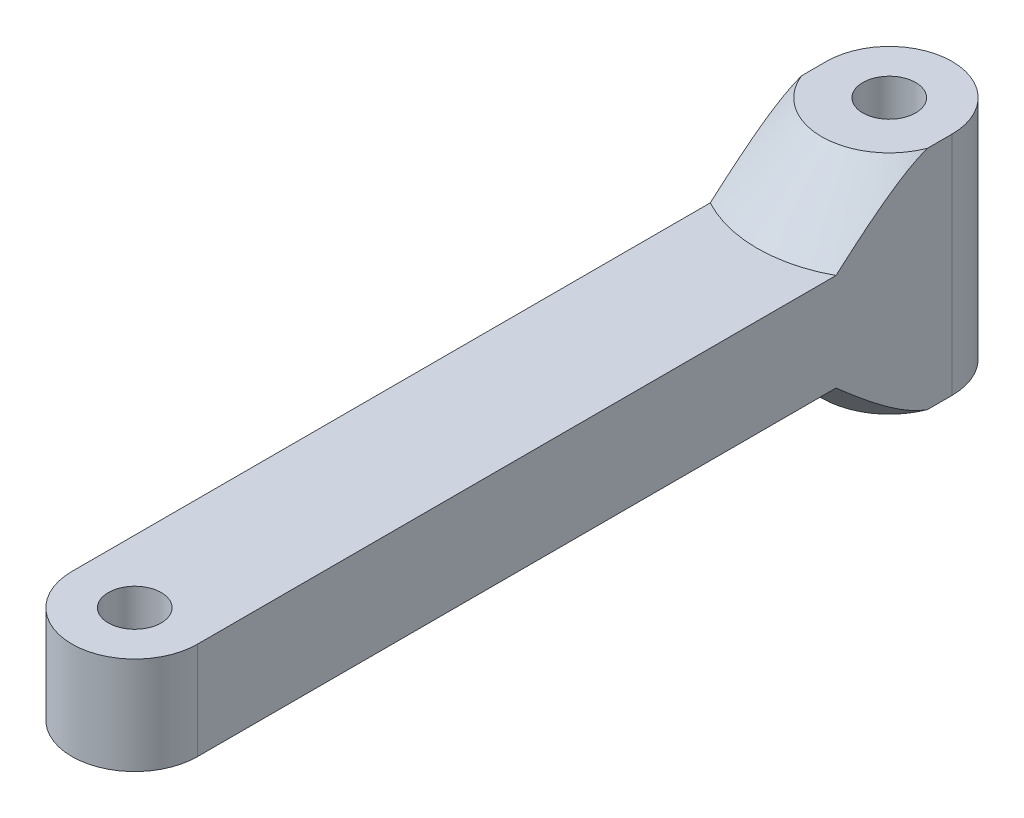
ISO-10303-21;
HEADER;
FILE_DESCRIPTION(('STEP AP214'),'2;1');
FILE_NAME('part.step','',(''),(''),'','','');
FILE_SCHEMA(('AUTOMOTIVE_DESIGN { 1 0 10303 214 1 1 1 1 }'));
ENDSEC;
DATA;
#1=APPLICATION_CONTEXT('core data for automotive mechanical design processes');
#2=APPLICATION_PROTOCOL_DEFINITION('international standard','automotive_design',2000,#1);
#3=PRODUCT_CONTEXT('',#1,'mechanical');
#4=PRODUCT('Part','Part','',(#3));
#5=PRODUCT_RELATED_PRODUCT_CATEGORY('part','',(#4));
#6=PRODUCT_DEFINITION_FORMATION('','',#4);
#7=PRODUCT_DEFINITION_CONTEXT('part definition',#1,'design');
#8=PRODUCT_DEFINITION('design','',#6,#7);
#9=PRODUCT_DEFINITION_SHAPE('','',#8);
#10=(LENGTH_UNIT() NAMED_UNIT(*) SI_UNIT(.MILLI.,.METRE.));
#11=(NAMED_UNIT(*) PLANE_ANGLE_UNIT() SI_UNIT($,.RADIAN.));
#12=(NAMED_UNIT(*) SI_UNIT($,.STERADIAN.) SOLID_ANGLE_UNIT());
#13=UNCERTAINTY_MEASURE_WITH_UNIT(LENGTH_MEASURE(1.E-05),#10,'distance_accuracy_value','');
#14=(GEOMETRIC_REPRESENTATION_CONTEXT(3) GLOBAL_UNCERTAINTY_ASSIGNED_CONTEXT((#13)) GLOBAL_UNIT_ASSIGNED_CONTEXT((#10,
#11,#12)) REPRESENTATION_CONTEXT('',''));
#15=CARTESIAN_POINT('',(0.,0.,0.));
#16=DIRECTION('',(0.,0.,1.));
#17=DIRECTION('',(1.,0.,0.));
#18=AXIS2_PLACEMENT_3D('',#15,#16,#17);
#19=CARTESIAN_POINT('',(0.,3.875,0.));
#20=DIRECTION('',(0.,1.,0.));
#21=DIRECTION('',(0.,0.,1.));
#22=AXIS2_PLACEMENT_3D('',#19,#20,#21);
#23=PLANE('',#22);
#24=CARTESIAN_POINT('',(0.,3.875,0.));
#25=DIRECTION('',(0.,1.,0.));
#26=DIRECTION('',(0.,0.,1.));
#27=AXIS2_PLACEMENT_3D('',#24,#25,#26);
#28=CIRCLE('',#27,2.1);
#29=CARTESIAN_POINT('',(0.,3.875,2.1));
#30=VERTEX_POINT('',#29);
#31=EDGE_CURVE('E253',#30,#30,#28,.T.);
#32=ORIENTED_EDGE('',*,*,#31,.F.);
#33=EDGE_LOOP('',(#32));
#34=FACE_BOUND('',#33,.T.);
#35=DIRECTION('',(0.,0.,-1.));
#36=VECTOR('',#35,1.);
#37=CARTESIAN_POINT('',(5.,3.875,0.));
#38=LINE('',#37,#36);
#39=CARTESIAN_POINT('',(5.,3.875,0.));
#40=VERTEX_POINT('',#39);
#41=CARTESIAN_POINT('',(5.,3.875,-50.7669073436902));
#42=VERTEX_POINT('',#41);
#43=EDGE_CURVE('E112',#40,#42,#38,.T.);
#44=ORIENTED_EDGE('',*,*,#43,.T.);
#45=CARTESIAN_POINT('',(0.,3.875,-60.));
#46=DIRECTION('',(0.,1.,0.));
#47=DIRECTION('',(0.,0.,1.));
#48=AXIS2_PLACEMENT_3D('',#45,#46,#47);
#49=CIRCLE('',#48,10.5000000000001);
#50=CARTESIAN_POINT('',(-5.,3.875,-50.7669073436902));
#51=VERTEX_POINT('',#50);
#52=EDGE_CURVE('E146',#42,#51,#49,.F.);
#53=ORIENTED_EDGE('',*,*,#52,.T.);
#54=DIRECTION('',(0.,0.,1.));
#55=VECTOR('',#54,1.);
#56=CARTESIAN_POINT('',(-5.,3.875,0.));
#57=LINE('',#56,#55);
#58=CARTESIAN_POINT('',(-5.,3.875,0.));
#59=VERTEX_POINT('',#58);
#60=EDGE_CURVE('E125',#51,#59,#57,.T.);
#61=ORIENTED_EDGE('',*,*,#60,.T.);
#62=CARTESIAN_POINT('',(0.,3.875,0.));
#63=DIRECTION('',(0.,1.,0.));
#64=DIRECTION('',(0.,0.,1.));
#65=AXIS2_PLACEMENT_3D('',#62,#63,#64);
#66=CIRCLE('',#65,5.);
#67=EDGE_CURVE('E126',#59,#40,#66,.T.);
#68=ORIENTED_EDGE('',*,*,#67,.T.);
#69=EDGE_LOOP('',(#44,#53,#61,#68));
#70=FACE_BOUND('',#69,.T.);
#71=ADVANCED_FACE('F41',(#34,#70),#23,.T.);
#72=CARTESIAN_POINT('',(0.,-3.875,0.));
#73=DIRECTION('',(0.,1.,0.));
#74=DIRECTION('',(0.,0.,1.));
#75=AXIS2_PLACEMENT_3D('',#72,#73,#74);
#76=PLANE('',#75);
#77=CARTESIAN_POINT('',(0.,-3.875,0.));
#78=DIRECTION('',(0.,1.,0.));
#79=DIRECTION('',(0.,0.,1.));
#80=AXIS2_PLACEMENT_3D('',#77,#78,#79);
#81=CIRCLE('',#80,2.1);
#82=CARTESIAN_POINT('',(0.,-3.875,2.1));
#83=VERTEX_POINT('',#82);
#84=EDGE_CURVE('E246',#83,#83,#81,.T.);
#85=ORIENTED_EDGE('',*,*,#84,.T.);
#86=EDGE_LOOP('',(#85));
#87=FACE_BOUND('',#86,.T.);
#88=DIRECTION('',(0.,0.,1.));
#89=VECTOR('',#88,1.);
#90=CARTESIAN_POINT('',(-5.,-3.875,0.));
#91=LINE('',#90,#89);
#92=CARTESIAN_POINT('',(-5.,-3.875,-50.7669073436903));
#93=VERTEX_POINT('',#92);
#94=CARTESIAN_POINT('',(-5.,-3.875,0.));
#95=VERTEX_POINT('',#94);
#96=EDGE_CURVE('E134',#93,#95,#91,.T.);
#97=ORIENTED_EDGE('',*,*,#96,.F.);
#98=CARTESIAN_POINT('',(0.,-3.875,-60.));
#99=DIRECTION('',(0.,1.,0.));
#100=DIRECTION('',(0.,0.,1.));
#101=AXIS2_PLACEMENT_3D('',#98,#99,#100);
#102=CIRCLE('',#101,10.5);
#103=CARTESIAN_POINT('',(5.,-3.875,-50.7669073436903));
#104=VERTEX_POINT('',#103);
#105=EDGE_CURVE('E140',#93,#104,#102,.T.);
#106=ORIENTED_EDGE('',*,*,#105,.T.);
#107=DIRECTION('',(0.,0.,-1.));
#108=VECTOR('',#107,1.);
#109=CARTESIAN_POINT('',(5.,-3.875,0.));
#110=LINE('',#109,#108);
#111=CARTESIAN_POINT('',(5.,-3.875,0.));
#112=VERTEX_POINT('',#111);
#113=EDGE_CURVE('E222',#112,#104,#110,.T.);
#114=ORIENTED_EDGE('',*,*,#113,.F.);
#115=CARTESIAN_POINT('',(0.,-3.875,0.));
#116=DIRECTION('',(0.,1.,0.));
#117=DIRECTION('',(0.,0.,1.));
#118=AXIS2_PLACEMENT_3D('',#115,#116,#117);
#119=CIRCLE('',#118,5.);
#120=EDGE_CURVE('E138',#95,#112,#119,.T.);
#121=ORIENTED_EDGE('',*,*,#120,.F.);
#122=EDGE_LOOP('',(#97,#106,#114,#121));
#123=FACE_BOUND('',#122,.T.);
#124=ADVANCED_FACE('F186',(#87,#123),#76,.F.);
#125=CARTESIAN_POINT('',(0.,3.875,0.));
#126=DIRECTION('',(0.,-1.,0.));
#127=DIRECTION('',(0.,0.,-1.));
#128=AXIS2_PLACEMENT_3D('',#125,#126,#127);
#129=CYLINDRICAL_SURFACE('',#128,5.);
#130=ORIENTED_EDGE('',*,*,#120,.T.);
#131=DIRECTION('',(0.,-1.,0.));
#132=VECTOR('',#131,1.);
#133=CARTESIAN_POINT('',(5.,3.875,0.));
#134=LINE('',#133,#132);
#135=EDGE_CURVE('E117',#40,#112,#134,.T.);
#136=ORIENTED_EDGE('',*,*,#135,.F.);
#137=ORIENTED_EDGE('',*,*,#67,.F.);
#138=DIRECTION('',(0.,-1.,0.));
#139=VECTOR('',#138,1.);
#140=CARTESIAN_POINT('',(-5.,3.875,0.));
#141=LINE('',#140,#139);
#142=EDGE_CURVE('E237',#59,#95,#141,.T.);
#143=ORIENTED_EDGE('',*,*,#142,.T.);
#144=EDGE_LOOP('',(#130,#136,#137,#143));
#145=FACE_BOUND('',#144,.T.);
#146=ADVANCED_FACE('F136',(#145),#129,.T.);
#147=CARTESIAN_POINT('',(5.,3.875,0.));
#148=DIRECTION('',(-1.,0.,0.));
#149=DIRECTION('',(0.,0.,1.));
#150=AXIS2_PLACEMENT_3D('',#147,#148,#149);
#151=PLANE('',#150);
#152=ORIENTED_EDGE('',*,*,#113,.T.);
#153=CARTESIAN_POINT('',(5.,-3.875,-50.7669073436903));
#154=CARTESIAN_POINT('',(5.,-4.01971598849579,-50.9314919699273));
#155=CARTESIAN_POINT('',(5.,-4.1639493716717,-51.0965032375605));
#156=CARTESIAN_POINT('',(5.,-4.45126957204784,-51.4275301742866));
#157=CARTESIAN_POINT('',(5.,-4.59435635122837,-51.5935458763675));
#158=CARTESIAN_POINT('',(5.,-4.87931998211735,-51.9268711772716));
#159=CARTESIAN_POINT('',(5.,-5.02119563517117,-52.0941818019338));
#160=CARTESIAN_POINT('',(5.,-5.30336332123864,-52.4301315363657));
#161=CARTESIAN_POINT('',(5.,-5.44365537013182,-52.5987706327854));
#162=CARTESIAN_POINT('',(5.,-5.72442969691356,-52.9401182460885));
#163=CARTESIAN_POINT('',(5.,-5.86488378077753,-53.1128499858756));
#164=CARTESIAN_POINT('',(5.,-6.14345285463368,-53.4601886224498));
#165=CARTESIAN_POINT('',(5.,-6.28156787583037,-53.6347954941708));
#166=CARTESIAN_POINT('',(5.,-6.55490196814796,-53.986172151773));
#167=CARTESIAN_POINT('',(5.,-6.69012199906723,-54.1629411892894));
#168=CARTESIAN_POINT('',(5.,-6.9570360167112,-54.5191157112881));
#169=CARTESIAN_POINT('',(5.,-7.08873015181964,-54.6985210843292));
#170=CARTESIAN_POINT('',(5.,-7.3685986360361,-55.0896779959594));
#171=CARTESIAN_POINT('',(5.,-7.51600654118542,-55.3019809016229));
#172=CARTESIAN_POINT('',(5.,-7.80301609945039,-55.7319077428479));
#173=CARTESIAN_POINT('',(5.,-7.9426159665539,-55.9495328795884));
#174=CARTESIAN_POINT('',(5.,-8.21100542731597,-56.3909140013737));
#175=CARTESIAN_POINT('',(5.,-8.33981235069278,-56.6146593621457));
#176=CARTESIAN_POINT('',(5.,-8.58290652164166,-57.0699167479803));
#177=CARTESIAN_POINT('',(5.,-8.69720081654621,-57.3014249338402));
#178=CARTESIAN_POINT('',(5.,-8.87116747342159,-57.6951895936233));
#179=CARTESIAN_POINT('',(5.,-8.93639183350701,-57.8549815165499));
#180=CARTESIAN_POINT('',(5.,-9.05575467351057,-58.1787341043541));
#181=CARTESIAN_POINT('',(5.,-9.10989180781256,-58.3426952725265));
#182=CARTESIAN_POINT('',(5.,-9.20450911023407,-58.6737281940993));
#183=CARTESIAN_POINT('',(5.,-9.24505212467734,-58.8407817573127));
#184=CARTESIAN_POINT('',(5.,-9.31054804738382,-59.1778581062459));
#185=CARTESIAN_POINT('',(5.,-9.33551447012895,-59.3478781861268));
#186=CARTESIAN_POINT('',(5.,-9.35954640925023,-59.5985918422289));
#187=CARTESIAN_POINT('',(5.,-9.36532505617897,-59.6786798119947));
#188=CARTESIAN_POINT('',(5.,-9.37305842534963,-59.8391735637367));
#189=CARTESIAN_POINT('',(5.,-9.37500675480122,-59.9195796529799));
#190=CARTESIAN_POINT('',(5.,-9.3750000000001,-60.));
#191=B_SPLINE_CURVE_WITH_KNOTS('',3,(#153,#154,#155,#156,#157,#158,#159,#160,#161,#162,#163,
#164,#165,#166,#167,#168,#169,#170,#171,#172,#173,#174,#175,#176,#177,#178,#179,#180,#181,#182,
#183,#184,#185,#186,#187,#188,#189,#190),.UNSPECIFIED.,.F.,.F.,(4,2,2,2,2,2,2,2,2,2,2,2,2,2,2,2,
2,2,4),(0.,0.657479640295268,1.31498099217978,1.97307132503851,2.63115505304804,
3.29902478138143,3.96688559290235,4.63452144284482,5.30212915170297,6.07737897532751,
6.85280541056131,7.62696191877513,8.40074104708055,8.9181912776782,9.43570427215405,
9.9507906833294,10.4654295741529,10.7062381890889,10.9474483729452),.UNSPECIFIED.);
#192=CARTESIAN_POINT('',(5.,-9.,-58.0275332702423));
#193=VERTEX_POINT('',#192);
#194=EDGE_CURVE('E164',#104,#193,#191,.T.);
#195=ORIENTED_EDGE('',*,*,#194,.T.);
#196=DIRECTION('',(0.,0.,1.));
#197=VECTOR('',#196,1.);
#198=CARTESIAN_POINT('',(5.,-9.,-60.));
#199=LINE('',#198,#197);
#200=CARTESIAN_POINT('',(5.,-9.,-60.));
#201=VERTEX_POINT('',#200);
#202=EDGE_CURVE('E199',#201,#193,#199,.T.);
#203=ORIENTED_EDGE('',*,*,#202,.F.);
#204=DIRECTION('',(0.,-1.,0.));
#205=VECTOR('',#204,1.);
#206=CARTESIAN_POINT('',(5.,3.875,-60.));
#207=LINE('',#206,#205);
#208=CARTESIAN_POINT('',(5.,9.,-60.));
#209=VERTEX_POINT('',#208);
#210=EDGE_CURVE('E141',#209,#201,#207,.T.);
#211=ORIENTED_EDGE('',*,*,#210,.F.);
#212=DIRECTION('',(0.,0.,-1.));
#213=VECTOR('',#212,1.);
#214=CARTESIAN_POINT('',(5.,9.,0.));
#215=LINE('',#214,#213);
#216=CARTESIAN_POINT('',(5.,9.,-58.0275332702424));
#217=VERTEX_POINT('',#216);
#218=EDGE_CURVE('E11',#209,#217,#215,.F.);
#219=ORIENTED_EDGE('',*,*,#218,.T.);
#220=CARTESIAN_POINT('',(5.,9.37500000000004,-60.));
#221=CARTESIAN_POINT('',(5.,9.37500620782414,-59.9230445299401));
#222=CARTESIAN_POINT('',(5.,9.37322245757581,-59.8461003728485));
#223=CARTESIAN_POINT('',(5.,9.36613350151536,-59.6923867696457));
#224=CARTESIAN_POINT('',(5.,9.36082887638487,-59.6156172968194));
#225=CARTESIAN_POINT('',(5.,9.33975216479667,-59.38610617518));
#226=CARTESIAN_POINT('',(5.,9.3188167108698,-59.2338138032467));
#227=CARTESIAN_POINT('',(5.,9.26480035865172,-58.9344252496194));
#228=CARTESIAN_POINT('',(5.,9.2319564096161,-58.7872852569143));
#229=CARTESIAN_POINT('',(5.,9.15553002968612,-58.4957886644185));
#230=CARTESIAN_POINT('',(5.,9.11194239957836,-58.3514334488496));
#231=CARTESIAN_POINT('',(5.,8.95845410281823,-57.8962887567637));
#232=CARTESIAN_POINT('',(5.,8.83124526960499,-57.5912948855139));
#233=CARTESIAN_POINT('',(5.,8.61855155214308,-57.1445076039472));
#234=CARTESIAN_POINT('',(5.,8.54391488600827,-56.9972099141717));
#235=CARTESIAN_POINT('',(5.,8.3886370036102,-56.7058003414683));
#236=CARTESIAN_POINT('',(5.,8.30799649143467,-56.5616880875382));
#237=CARTESIAN_POINT('',(5.,8.13998751590453,-56.2731458917103));
#238=CARTESIAN_POINT('',(5.,8.05250907637106,-56.1287806180112));
#239=CARTESIAN_POINT('',(5.,7.87337826286647,-55.8426537855585));
#240=CARTESIAN_POINT('',(5.,7.78172556235495,-55.7008924317235));
#241=CARTESIAN_POINT('',(5.,7.59507629215959,-55.4197816554874));
#242=CARTESIAN_POINT('',(5.,7.50008283022762,-55.280430162413));
#243=CARTESIAN_POINT('',(5.,7.30725006150687,-55.0037082652957));
#244=CARTESIAN_POINT('',(5.,7.2094106579108,-54.8663379288819));
#245=CARTESIAN_POINT('',(5.,6.98225331583684,-54.5532123196063));
#246=CARTESIAN_POINT('',(5.,6.8521336476002,-54.3780392923126));
#247=CARTESIAN_POINT('',(5.,6.58869285163815,-54.0301190387981));
#248=CARTESIAN_POINT('',(5.,6.45537165265003,-53.8573718667102));
#249=CARTESIAN_POINT('',(5.,6.18606950085157,-53.5138646106626));
#250=CARTESIAN_POINT('',(5.,6.05008759141134,-53.3431052779585));
#251=CARTESIAN_POINT('',(5.,5.77596697794933,-53.0033263628371));
#252=CARTESIAN_POINT('',(5.,5.63782825082806,-52.8343067990848));
#253=CARTESIAN_POINT('',(5.,5.36610223845678,-52.5054407418882));
#254=CARTESIAN_POINT('',(5.,5.2325952130683,-52.3455278478676));
#255=CARTESIAN_POINT('',(5.,4.96418883562373,-52.026874059781));
#256=CARTESIAN_POINT('',(5.,4.8292894748411,-51.8681331730712));
#257=CARTESIAN_POINT('',(5.,4.55841049332242,-51.5517985969286));
#258=CARTESIAN_POINT('',(5.,4.42243183156918,-51.3942040855268));
#259=CARTESIAN_POINT('',(5.,4.14944759692059,-51.0799136313472));
#260=CARTESIAN_POINT('',(5.,4.01244204984865,-50.9232176661471));
#261=CARTESIAN_POINT('',(5.,3.875,-50.7669073436902));
#262=B_SPLINE_CURVE_WITH_KNOTS('',3,(#220,#221,#222,#223,#224,#225,#226,#227,#228,#229,#230,
#231,#232,#233,#234,#235,#236,#237,#238,#239,#240,#241,#242,#243,#244,#245,#246,#247,#248,#249,
#250,#251,#252,#253,#254,#255,#256,#257,#258,#259,#260,#261),.UNSPECIFIED.,.F.,.F.,(4,2,2,2,2,2,
2,2,2,2,2,2,2,2,2,2,2,2,2,2,4),(0.,0.230824134272519,0.461610209243227,0.922142248521532,
1.37397300884593,1.82602285541044,2.81455595863844,3.30988827456912,3.80516259272366,
4.31148858298634,4.81785424993194,5.32376072046427,5.82968442003379,6.48427415375995,
7.13887847149401,7.7937226347989,8.4485738162963,9.07351782145017,9.69846574585423,
10.3229096454597,10.9473378943189),.UNSPECIFIED.);
#263=EDGE_CURVE('E120',#217,#42,#262,.T.);
#264=ORIENTED_EDGE('',*,*,#263,.T.);
#265=ORIENTED_EDGE('',*,*,#43,.F.);
#266=ORIENTED_EDGE('',*,*,#135,.T.);
#267=EDGE_LOOP('',(#152,#195,#203,#211,#219,#264,#265,#266));
#268=FACE_BOUND('',#267,.T.);
#269=ADVANCED_FACE('F115',(#268),#151,.F.);
#270=CARTESIAN_POINT('',(0.,3.875,-60.));
#271=DIRECTION('',(0.,-1.,0.));
#272=DIRECTION('',(0.,0.,-1.));
#273=AXIS2_PLACEMENT_3D('',#270,#271,#272);
#274=CYLINDRICAL_SURFACE('',#273,5.);
#275=CARTESIAN_POINT('',(0.,-9.,-60.));
#276=DIRECTION('',(0.,1.,0.));
#277=DIRECTION('',(0.,0.,1.));
#278=AXIS2_PLACEMENT_3D('',#275,#276,#277);
#279=CIRCLE('',#278,5.);
#280=CARTESIAN_POINT('',(-5.,-9.,-60.));
#281=VERTEX_POINT('',#280);
#282=EDGE_CURVE('E227',#201,#281,#279,.T.);
#283=ORIENTED_EDGE('',*,*,#282,.T.);
#284=DIRECTION('',(0.,-1.,0.));
#285=VECTOR('',#284,1.);
#286=CARTESIAN_POINT('',(-5.,3.875,-60.));
#287=LINE('',#286,#285);
#288=CARTESIAN_POINT('',(-5.,9.,-60.));
#289=VERTEX_POINT('',#288);
#290=EDGE_CURVE('E148',#289,#281,#287,.T.);
#291=ORIENTED_EDGE('',*,*,#290,.F.);
#292=CARTESIAN_POINT('',(0.,9.,-60.));
#293=DIRECTION('',(0.,1.,0.));
#294=DIRECTION('',(0.,0.,1.));
#295=AXIS2_PLACEMENT_3D('',#292,#293,#294);
#296=CIRCLE('',#295,5.);
#297=EDGE_CURVE('E209',#209,#289,#296,.T.);
#298=ORIENTED_EDGE('',*,*,#297,.F.);
#299=ORIENTED_EDGE('',*,*,#210,.T.);
#300=EDGE_LOOP('',(#283,#291,#298,#299));
#301=FACE_BOUND('',#300,.T.);
#302=ADVANCED_FACE('F189',(#301),#274,.T.);
#303=CARTESIAN_POINT('',(-5.,3.875,0.));
#304=DIRECTION('',(1.,0.,0.));
#305=DIRECTION('',(0.,0.,-1.));
#306=AXIS2_PLACEMENT_3D('',#303,#304,#305);
#307=PLANE('',#306);
#308=ORIENTED_EDGE('',*,*,#290,.T.);
#309=DIRECTION('',(0.,0.,-1.));
#310=VECTOR('',#309,1.);
#311=CARTESIAN_POINT('',(-5.,-9.,-60.));
#312=LINE('',#311,#310);
#313=CARTESIAN_POINT('',(-5.,-9.,-58.0275332702423));
#314=VERTEX_POINT('',#313);
#315=EDGE_CURVE('E52',#281,#314,#312,.F.);
#316=ORIENTED_EDGE('',*,*,#315,.T.);
#317=CARTESIAN_POINT('',(-5.,-9.3750000000001,-60.));
#318=CARTESIAN_POINT('',(-5.,-9.3750062078242,-59.9230445299401));
#319=CARTESIAN_POINT('',(-5.,-9.37322245757587,-59.8461003728485));
#320=CARTESIAN_POINT('',(-5.,-9.36613350151542,-59.6923867696457));
#321=CARTESIAN_POINT('',(-5.,-9.36082887638493,-59.6156172968194));
#322=CARTESIAN_POINT('',(-5.,-9.33975216479673,-59.38610617518));
#323=CARTESIAN_POINT('',(-5.,-9.31881671086986,-59.2338138032467));
#324=CARTESIAN_POINT('',(-5.,-9.26480035865177,-58.9344252496194));
#325=CARTESIAN_POINT('',(-5.,-9.23195640961615,-58.7872852569144));
#326=CARTESIAN_POINT('',(-5.,-9.15553002968618,-58.4957886644185));
#327=CARTESIAN_POINT('',(-5.,-9.11194239957842,-58.3514334488496));
#328=CARTESIAN_POINT('',(-5.,-8.95845410281829,-57.8962887567638));
#329=CARTESIAN_POINT('',(-5.,-8.83124526960505,-57.591294885514));
#330=CARTESIAN_POINT('',(-5.,-8.61855155214315,-57.1445076039473));
#331=CARTESIAN_POINT('',(-5.,-8.54391488600834,-56.9972099141718));
#332=CARTESIAN_POINT('',(-5.,-8.38863700361028,-56.7058003414684));
#333=CARTESIAN_POINT('',(-5.,-8.30799649143475,-56.5616880875383));
#334=CARTESIAN_POINT('',(-5.,-8.13998751590462,-56.2731458917103));
#335=CARTESIAN_POINT('',(-5.,-8.05250907637116,-56.1287806180113));
#336=CARTESIAN_POINT('',(-5.,-7.87337826286657,-55.8426537855586));
#337=CARTESIAN_POINT('',(-5.,-7.78172556235505,-55.7008924317237));
#338=CARTESIAN_POINT('',(-5.,-7.59507629215969,-55.4197816554876));
#339=CARTESIAN_POINT('',(-5.,-7.50008283022772,-55.2804301624132));
#340=CARTESIAN_POINT('',(-5.,-7.30725006150698,-55.0037082652958));
#341=CARTESIAN_POINT('',(-5.,-7.20941065791092,-54.866337928882));
#342=CARTESIAN_POINT('',(-5.,-6.98225331583695,-54.5532123196064));
#343=CARTESIAN_POINT('',(-5.,-6.85213364760031,-54.3780392923127));
#344=CARTESIAN_POINT('',(-5.,-6.58869285163825,-54.0301190387982));
#345=CARTESIAN_POINT('',(-5.,-6.45537165265013,-53.8573718667103));
#346=CARTESIAN_POINT('',(-5.,-6.18606950085166,-53.5138646106627));
#347=CARTESIAN_POINT('',(-5.,-6.05008759141142,-53.3431052779586));
#348=CARTESIAN_POINT('',(-5.,-5.7759669779494,-53.0033263628372));
#349=CARTESIAN_POINT('',(-5.,-5.63782825082812,-52.834306799085));
#350=CARTESIAN_POINT('',(-5.,-5.36610223845684,-52.5054407418883));
#351=CARTESIAN_POINT('',(-5.,-5.23259521306835,-52.3455278478677));
#352=CARTESIAN_POINT('',(-5.,-4.96418883562377,-52.0268740597811));
#353=CARTESIAN_POINT('',(-5.,-4.82928947484114,-51.8681331730713));
#354=CARTESIAN_POINT('',(-5.,-4.55841049332244,-51.5517985969287));
#355=CARTESIAN_POINT('',(-5.,-4.4224318315692,-51.3942040855269));
#356=CARTESIAN_POINT('',(-5.,-4.1494475969206,-51.0799136313473));
#357=CARTESIAN_POINT('',(-5.,-4.01244204984865,-50.9232176661472));
#358=CARTESIAN_POINT('',(-5.,-3.875,-50.7669073436903));
#359=B_SPLINE_CURVE_WITH_KNOTS('',3,(#317,#318,#319,#320,#321,#322,#323,#324,#325,#326,#327,
#328,#329,#330,#331,#332,#333,#334,#335,#336,#337,#338,#339,#340,#341,#342,#343,#344,#345,#346,
#347,#348,#349,#350,#351,#352,#353,#354,#355,#356,#357,#358),.UNSPECIFIED.,.F.,.F.,(4,2,2,2,2,2,
2,2,2,2,2,2,2,2,2,2,2,2,2,2,4),(0.,0.230824134272519,0.461610209243227,0.922142248521524,
1.37397300884591,1.82602285541041,2.81455595863838,3.30988827456905,3.80516259272356,
4.31148858298623,4.81785424993182,5.32376072046414,5.82968442003363,6.4842741537598,
7.13887847149388,7.79372263479879,8.4485738162962,9.07351782145008,9.69846574585418,
10.3229096454596,10.9473378943189),.UNSPECIFIED.);
#360=EDGE_CURVE('E156',#314,#93,#359,.T.);
#361=ORIENTED_EDGE('',*,*,#360,.T.);
#362=ORIENTED_EDGE('',*,*,#96,.T.);
#363=ORIENTED_EDGE('',*,*,#142,.F.);
#364=ORIENTED_EDGE('',*,*,#60,.F.);
#365=CARTESIAN_POINT('',(-5.,3.875,-50.7669073436902));
#366=CARTESIAN_POINT('',(-5.,4.01971598849579,-50.9314919699273));
#367=CARTESIAN_POINT('',(-5.,4.1639493716717,-51.0965032375604));
#368=CARTESIAN_POINT('',(-5.,4.45126957204784,-51.4275301742866));
#369=CARTESIAN_POINT('',(-5.,4.59435635122837,-51.5935458763674));
#370=CARTESIAN_POINT('',(-5.,4.87931998211735,-51.9268711772716));
#371=CARTESIAN_POINT('',(-5.,5.02119563517117,-52.0941818019338));
#372=CARTESIAN_POINT('',(-5.,5.30336332123864,-52.4301315363657));
#373=CARTESIAN_POINT('',(-5.,5.44365537013182,-52.5987706327854));
#374=CARTESIAN_POINT('',(-5.,5.72442969691356,-52.9401182460885));
#375=CARTESIAN_POINT('',(-5.,5.86488378077753,-53.1128499858756));
#376=CARTESIAN_POINT('',(-5.,6.14345285463369,-53.4601886224498));
#377=CARTESIAN_POINT('',(-5.,6.28156787583038,-53.6347954941708));
#378=CARTESIAN_POINT('',(-5.,6.55490196814797,-53.986172151773));
#379=CARTESIAN_POINT('',(-5.,6.69012199906724,-54.1629411892894));
#380=CARTESIAN_POINT('',(-5.,6.9570360167112,-54.5191157112881));
#381=CARTESIAN_POINT('',(-5.,7.08873015181964,-54.6985210843292));
#382=CARTESIAN_POINT('',(-5.,7.3685986360361,-55.0896779959594));
#383=CARTESIAN_POINT('',(-5.,7.51600654118542,-55.3019809016229));
#384=CARTESIAN_POINT('',(-5.,7.80301609945038,-55.7319077428479));
#385=CARTESIAN_POINT('',(-5.,7.94261596655389,-55.9495328795885));
#386=CARTESIAN_POINT('',(-5.,8.21100542731596,-56.3909140013737));
#387=CARTESIAN_POINT('',(-5.,8.33981235069277,-56.6146593621458));
#388=CARTESIAN_POINT('',(-5.,8.58290652164164,-57.0699167479804));
#389=CARTESIAN_POINT('',(-5.,8.69720081654619,-57.3014249338402));
#390=CARTESIAN_POINT('',(-5.,8.87116747342157,-57.6951895936234));
#391=CARTESIAN_POINT('',(-5.,8.93639183350699,-57.85498151655));
#392=CARTESIAN_POINT('',(-5.,9.05575467351054,-58.1787341043542));
#393=CARTESIAN_POINT('',(-5.,9.10989180781253,-58.3426952725265));
#394=CARTESIAN_POINT('',(-5.,9.20450911023404,-58.6737281940993));
#395=CARTESIAN_POINT('',(-5.,9.2450521246773,-58.8407817573127));
#396=CARTESIAN_POINT('',(-5.,9.31054804738378,-59.1778581062459));
#397=CARTESIAN_POINT('',(-5.,9.3355144701289,-59.3478781861269));
#398=CARTESIAN_POINT('',(-5.,9.35954640925018,-59.598591842229));
#399=CARTESIAN_POINT('',(-5.,9.36532505617892,-59.6786798119948));
#400=CARTESIAN_POINT('',(-5.,9.37305842534957,-59.8391735637367));
#401=CARTESIAN_POINT('',(-5.,9.37500675480117,-59.9195796529799));
#402=CARTESIAN_POINT('',(-5.,9.37500000000004,-60.));
#403=B_SPLINE_CURVE_WITH_KNOTS('',3,(#365,#366,#367,#368,#369,#370,#371,#372,#373,#374,#375,
#376,#377,#378,#379,#380,#381,#382,#383,#384,#385,#386,#387,#388,#389,#390,#391,#392,#393,#394,
#395,#396,#397,#398,#399,#400,#401,#402),.UNSPECIFIED.,.F.,.F.,(4,2,2,2,2,2,2,2,2,2,2,2,2,2,2,2,
2,2,4),(0.,0.657479640295273,1.3149809921798,1.97307132503853,2.63115505304807,3.29902478138147,
3.96688559290241,4.63452144284487,5.30212915170304,6.07737897532758,6.85280541056138,
7.62696191877521,8.40074104708064,8.91819127767828,9.43570427215414,9.95079068332949,
10.465429574153,10.706238189089,10.9474483729452),.UNSPECIFIED.);
#404=CARTESIAN_POINT('',(-5.,9.,-58.0275332702424));
#405=VERTEX_POINT('',#404);
#406=EDGE_CURVE('E212',#51,#405,#403,.T.);
#407=ORIENTED_EDGE('',*,*,#406,.T.);
#408=DIRECTION('',(0.,0.,1.));
#409=VECTOR('',#408,1.);
#410=CARTESIAN_POINT('',(-5.,9.,0.));
#411=LINE('',#410,#409);
#412=EDGE_CURVE('E202',#289,#405,#411,.T.);
#413=ORIENTED_EDGE('',*,*,#412,.F.);
#414=EDGE_LOOP('',(#308,#316,#361,#362,#363,#364,#407,#413));
#415=FACE_BOUND('',#414,.T.);
#416=ADVANCED_FACE('F171',(#415),#307,.F.);
#417=CARTESIAN_POINT('',(0.,3.875,0.));
#418=DIRECTION('',(0.,-1.,0.));
#419=DIRECTION('',(0.,0.,-1.));
#420=AXIS2_PLACEMENT_3D('',#417,#418,#419);
#421=CYLINDRICAL_SURFACE('',#420,2.1);
#422=ORIENTED_EDGE('',*,*,#31,.T.);
#423=EDGE_LOOP('',(#422));
#424=FACE_BOUND('',#423,.T.);
#425=ORIENTED_EDGE('',*,*,#84,.F.);
#426=EDGE_LOOP('',(#425));
#427=FACE_BOUND('',#426,.T.);
#428=ADVANCED_FACE('F265',(#424,#427),#421,.F.);
#429=CARTESIAN_POINT('',(0.,-9.,-60.));
#430=DIRECTION('',(0.,1.,0.));
#431=DIRECTION('',(0.,0.,1.));
#432=AXIS2_PLACEMENT_3D('',#429,#430,#431);
#433=PLANE('',#432);
#434=ORIENTED_EDGE('',*,*,#282,.F.);
#435=ORIENTED_EDGE('',*,*,#202,.T.);
#436=CARTESIAN_POINT('',(0.,-9.,-60.));
#437=DIRECTION('',(0.,1.,0.));
#438=DIRECTION('',(0.,0.,1.));
#439=AXIS2_PLACEMENT_3D('',#436,#437,#438);
#440=CIRCLE('',#439,5.37500000000009);
#441=EDGE_CURVE('E66',#193,#314,#440,.F.);
#442=ORIENTED_EDGE('',*,*,#441,.T.);
#443=ORIENTED_EDGE('',*,*,#315,.F.);
#444=EDGE_LOOP('',(#434,#435,#442,#443));
#445=FACE_BOUND('',#444,.T.);
#446=CARTESIAN_POINT('',(0.,-9.,-60.));
#447=DIRECTION('',(0.,1.,0.));
#448=DIRECTION('',(0.,0.,1.));
#449=AXIS2_PLACEMENT_3D('',#446,#447,#448);
#450=CIRCLE('',#449,2.1);
#451=CARTESIAN_POINT('',(0.,-9.,-57.9));
#452=VERTEX_POINT('',#451);
#453=EDGE_CURVE('E249',#452,#452,#450,.T.);
#454=ORIENTED_EDGE('',*,*,#453,.T.);
#455=EDGE_LOOP('',(#454));
#456=FACE_BOUND('',#455,.T.);
#457=ADVANCED_FACE('F224',(#445,#456),#433,.F.);
#458=CARTESIAN_POINT('',(0.,3.875,-60.));
#459=DIRECTION('',(0.,-1.,0.));
#460=DIRECTION('',(0.,0.,-1.));
#461=AXIS2_PLACEMENT_3D('',#458,#459,#460);
#462=CYLINDRICAL_SURFACE('',#461,2.1);
#463=ORIENTED_EDGE('',*,*,#453,.F.);
#464=EDGE_LOOP('',(#463));
#465=FACE_BOUND('',#464,.T.);
#466=CARTESIAN_POINT('',(0.,9.,-60.));
#467=DIRECTION('',(0.,1.,0.));
#468=DIRECTION('',(0.,0.,1.));
#469=AXIS2_PLACEMENT_3D('',#466,#467,#468);
#470=CIRCLE('',#469,2.1);
#471=CARTESIAN_POINT('',(0.,9.,-57.9));
#472=VERTEX_POINT('',#471);
#473=EDGE_CURVE('E242',#472,#472,#470,.T.);
#474=ORIENTED_EDGE('',*,*,#473,.T.);
#475=EDGE_LOOP('',(#474));
#476=FACE_BOUND('',#475,.T.);
#477=ADVANCED_FACE('F273',(#465,#476),#462,.F.);
#478=CARTESIAN_POINT('',(0.,9.,-60.));
#479=DIRECTION('',(0.,1.,0.));
#480=DIRECTION('',(0.,0.,1.));
#481=AXIS2_PLACEMENT_3D('',#478,#479,#480);
#482=PLANE('',#481);
#483=ORIENTED_EDGE('',*,*,#297,.T.);
#484=ORIENTED_EDGE('',*,*,#412,.T.);
#485=CARTESIAN_POINT('',(0.,9.,-60.));
#486=DIRECTION('',(0.,1.,0.));
#487=DIRECTION('',(0.,0.,1.));
#488=AXIS2_PLACEMENT_3D('',#485,#486,#487);
#489=CIRCLE('',#488,5.37500000000004);
#490=EDGE_CURVE('E59',#405,#217,#489,.T.);
#491=ORIENTED_EDGE('',*,*,#490,.T.);
#492=ORIENTED_EDGE('',*,*,#218,.F.);
#493=EDGE_LOOP('',(#483,#484,#491,#492));
#494=FACE_BOUND('',#493,.T.);
#495=ORIENTED_EDGE('',*,*,#473,.F.);
#496=EDGE_LOOP('',(#495));
#497=FACE_BOUND('',#496,.T.);
#498=ADVANCED_FACE('F182',(#494,#497),#482,.T.);
#499=CARTESIAN_POINT('',(0.,-9.3750000000001,-60.));
#500=DIRECTION('',(0.,1.,0.));
#501=DIRECTION('',(0.,0.,1.));
#502=AXIS2_PLACEMENT_3D('',#499,#500,#501);
#503=CONICAL_SURFACE('',#502,5.,0.785398163397443);
#504=ORIENTED_EDGE('',*,*,#194,.F.);
#505=ORIENTED_EDGE('',*,*,#105,.F.);
#506=ORIENTED_EDGE('',*,*,#360,.F.);
#507=ORIENTED_EDGE('',*,*,#441,.F.);
#508=EDGE_LOOP('',(#504,#505,#506,#507));
#509=FACE_BOUND('',#508,.T.);
#510=ADVANCED_FACE('F176',(#509),#503,.T.);
#511=CARTESIAN_POINT('',(0.,3.875,-60.));
#512=DIRECTION('',(0.,-1.,0.));
#513=DIRECTION('',(0.,0.,-1.));
#514=AXIS2_PLACEMENT_3D('',#511,#512,#513);
#515=CONICAL_SURFACE('',#514,10.5000000000001,0.785398163397453);
#516=ORIENTED_EDGE('',*,*,#263,.F.);
#517=ORIENTED_EDGE('',*,*,#490,.F.);
#518=ORIENTED_EDGE('',*,*,#406,.F.);
#519=ORIENTED_EDGE('',*,*,#52,.F.);
#520=EDGE_LOOP('',(#516,#517,#518,#519));
#521=FACE_BOUND('',#520,.T.);
#522=ADVANCED_FACE('F44',(#521),#515,.T.);
#523=CLOSED_SHELL('',(#71,#124,#146,#269,#302,#416,#428,#457,#477,#498,#510,#522));
#524=MANIFOLD_SOLID_BREP('B2',#523);
#525=ADVANCED_BREP_SHAPE_REPRESENTATION('',(#18,#524),#14);
#526=SHAPE_DEFINITION_REPRESENTATION(#9,#525);
ENDSEC;
END-ISO-10303-21;
